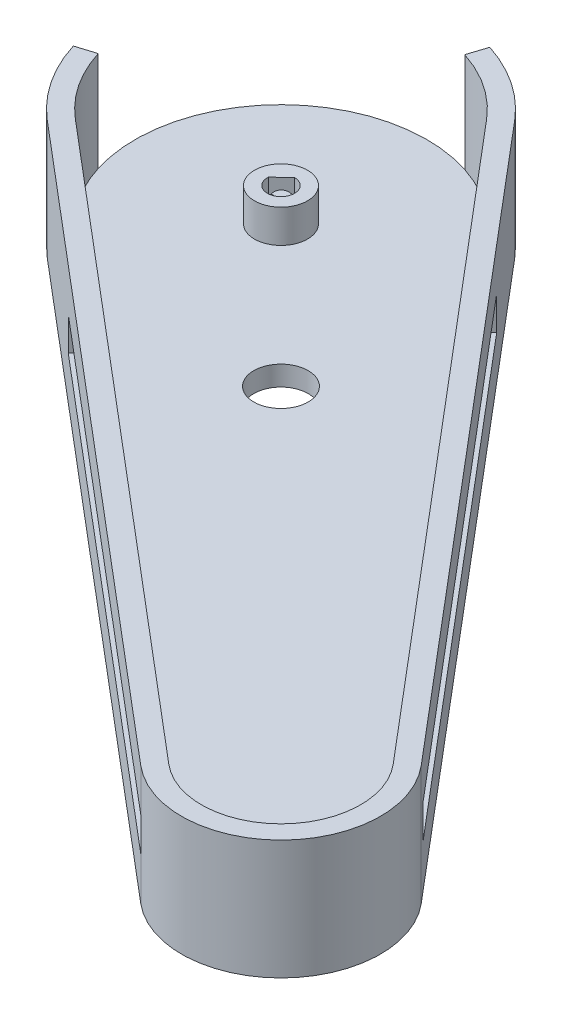
ISO-10303-21;
HEADER;
FILE_DESCRIPTION(('STEP AP214'),'2;1');
FILE_NAME('part.step','',(''),(''),'','','');
FILE_SCHEMA(('AUTOMOTIVE_DESIGN { 1 0 10303 214 1 1 1 1 }'));
ENDSEC;
DATA;
#1=APPLICATION_CONTEXT('core data for automotive mechanical design processes');
#2=APPLICATION_PROTOCOL_DEFINITION('international standard','automotive_design',2000,#1);
#3=PRODUCT_CONTEXT('',#1,'mechanical');
#4=PRODUCT('Part','Part','',(#3));
#5=PRODUCT_RELATED_PRODUCT_CATEGORY('part','',(#4));
#6=PRODUCT_DEFINITION_FORMATION('','',#4);
#7=PRODUCT_DEFINITION_CONTEXT('part definition',#1,'design');
#8=PRODUCT_DEFINITION('design','',#6,#7);
#9=PRODUCT_DEFINITION_SHAPE('','',#8);
#10=(LENGTH_UNIT() NAMED_UNIT(*) SI_UNIT(.MILLI.,.METRE.));
#11=(NAMED_UNIT(*) PLANE_ANGLE_UNIT() SI_UNIT($,.RADIAN.));
#12=(NAMED_UNIT(*) SI_UNIT($,.STERADIAN.) SOLID_ANGLE_UNIT());
#13=UNCERTAINTY_MEASURE_WITH_UNIT(LENGTH_MEASURE(1.E-05),#10,'distance_accuracy_value','');
#14=(GEOMETRIC_REPRESENTATION_CONTEXT(3) GLOBAL_UNCERTAINTY_ASSIGNED_CONTEXT((#13)) GLOBAL_UNIT_ASSIGNED_CONTEXT((#10,
#11,#12)) REPRESENTATION_CONTEXT('',''));
#15=CARTESIAN_POINT('',(0.,0.,0.));
#16=DIRECTION('',(0.,0.,1.));
#17=DIRECTION('',(1.,0.,0.));
#18=AXIS2_PLACEMENT_3D('',#15,#16,#17);
#19=CARTESIAN_POINT('',(-12.9144341357622,3.,15.2714567397174));
#20=DIRECTION('',(0.645721706788111,0.,-0.763572836985869));
#21=DIRECTION('',(-0.763572836985869,0.,-0.645721706788111));
#22=AXIS2_PLACEMENT_3D('',#19,#20,#21);
#23=PLANE('',#22);
#24=DIRECTION('',(-0.763572836985869,0.,-0.645721706788111));
#25=VECTOR('',#24,1.);
#26=CARTESIAN_POINT('',(-12.9144341357622,11.6,15.2714567397174));
#27=LINE('',#26,#25);
#28=CARTESIAN_POINT('',(32.7405812693717,11.6,53.8799994259803));
#29=VERTEX_POINT('',#28);
#30=CARTESIAN_POINT('',(-38.0703858584019,11.6,-6.00188261366093));
#31=VERTEX_POINT('',#30);
#32=EDGE_CURVE('E323',#29,#31,#27,.T.);
#33=ORIENTED_EDGE('',*,*,#32,.F.);
#34=DIRECTION('',(0.,-1.,0.));
#35=VECTOR('',#34,1.);
#36=CARTESIAN_POINT('',(32.7405812693714,3.,53.8799994259806));
#37=LINE('',#36,#35);
#38=CARTESIAN_POINT('',(32.7405812693718,18.,53.8799994259802));
#39=VERTEX_POINT('',#38);
#40=EDGE_CURVE('E407',#39,#29,#37,.T.);
#41=ORIENTED_EDGE('',*,*,#40,.F.);
#42=DIRECTION('',(0.763572836985869,0.,0.645721706788111));
#43=VECTOR('',#42,1.);
#44=CARTESIAN_POINT('',(-12.9144341357622,18.,15.2714567397174));
#45=LINE('',#44,#43);
#46=CARTESIAN_POINT('',(-58.5694495408956,18.,-23.3370859465461));
#47=VERTEX_POINT('',#46);
#48=EDGE_CURVE('E491',#47,#39,#45,.T.);
#49=ORIENTED_EDGE('',*,*,#48,.F.);
#50=DIRECTION('',(0.,-1.,0.));
#51=VECTOR('',#50,1.);
#52=CARTESIAN_POINT('',(-58.5694495408956,3.,-23.3370859465461));
#53=LINE('',#52,#51);
#54=CARTESIAN_POINT('',(-58.5694495408956,0.,-23.3370859465461));
#55=VERTEX_POINT('',#54);
#56=EDGE_CURVE('E599',#47,#55,#53,.T.);
#57=ORIENTED_EDGE('',*,*,#56,.T.);
#58=DIRECTION('',(0.763572836985869,0.,0.645721706788111));
#59=VECTOR('',#58,1.);
#60=CARTESIAN_POINT('',(-12.9144341357622,0.,15.2714567397174));
#61=LINE('',#60,#59);
#62=CARTESIAN_POINT('',(32.7405812693714,0.,53.8799994259806));
#63=VERTEX_POINT('',#62);
#64=EDGE_CURVE('E583',#55,#63,#61,.T.);
#65=ORIENTED_EDGE('',*,*,#64,.T.);
#66=CARTESIAN_POINT('',(32.7405812693714,6.5,53.8799994259806));
#67=VERTEX_POINT('',#66);
#68=EDGE_CURVE('E420',#67,#63,#37,.T.);
#69=ORIENTED_EDGE('',*,*,#68,.F.);
#70=DIRECTION('',(-0.763572836985869,0.,-0.645721706788111));
#71=VECTOR('',#70,1.);
#72=CARTESIAN_POINT('',(-12.9144341357622,6.5,15.2714567397174));
#73=LINE('',#72,#71);
#74=CARTESIAN_POINT('',(-38.0703858584019,6.5,-6.00188261366093));
#75=VERTEX_POINT('',#74);
#76=EDGE_CURVE('E304',#67,#75,#73,.T.);
#77=ORIENTED_EDGE('',*,*,#76,.T.);
#78=DIRECTION('',(0.,1.,0.));
#79=VECTOR('',#78,1.);
#80=CARTESIAN_POINT('',(-38.0703858584019,3.,-6.00188261366095));
#81=LINE('',#80,#79);
#82=EDGE_CURVE('E302',#75,#31,#81,.T.);
#83=ORIENTED_EDGE('',*,*,#82,.T.);
#84=EDGE_LOOP('',(#33,#41,#49,#57,#65,#69,#77,#83));
#85=FACE_BOUND('',#84,.T.);
#86=ADVANCED_FACE('F120',(#85),#23,.F.);
#87=CARTESIAN_POINT('',(15.2714567397174,3.,-12.9144341357622));
#88=DIRECTION('',(0.763572836985869,0.,-0.645721706788111));
#89=DIRECTION('',(-0.645721706788111,0.,-0.763572836985869));
#90=AXIS2_PLACEMENT_3D('',#87,#88,#89);
#91=PLANE('',#90);
#92=DIRECTION('',(0.645721706788111,0.,0.763572836985869));
#93=VECTOR('',#92,1.);
#94=CARTESIAN_POINT('',(15.2714567397174,0.,-12.9144341357622));
#95=LINE('',#94,#93);
#96=CARTESIAN_POINT('',(-23.3370859465461,0.,-58.5694495408956));
#97=VERTEX_POINT('',#96);
#98=CARTESIAN_POINT('',(53.8799994259812,0.,32.740581269371));
#99=VERTEX_POINT('',#98);
#100=EDGE_CURVE('E592',#97,#99,#95,.T.);
#101=ORIENTED_EDGE('',*,*,#100,.F.);
#102=DIRECTION('',(0.,-1.,0.));
#103=VECTOR('',#102,1.);
#104=CARTESIAN_POINT('',(-23.3370859465461,3.,-58.5694495408956));
#105=LINE('',#104,#103);
#106=CARTESIAN_POINT('',(-23.3370859465461,18.,-58.5694495408956));
#107=VERTEX_POINT('',#106);
#108=EDGE_CURVE('E601',#107,#97,#105,.T.);
#109=ORIENTED_EDGE('',*,*,#108,.F.);
#110=DIRECTION('',(-0.645721706788111,0.,-0.763572836985869));
#111=VECTOR('',#110,1.);
#112=CARTESIAN_POINT('',(15.2714567397174,18.,-12.9144341357622));
#113=LINE('',#112,#111);
#114=CARTESIAN_POINT('',(53.8799994259811,18.,32.7405812693711));
#115=VERTEX_POINT('',#114);
#116=EDGE_CURVE('E512',#115,#107,#113,.T.);
#117=ORIENTED_EDGE('',*,*,#116,.F.);
#118=DIRECTION('',(0.,-1.,0.));
#119=VECTOR('',#118,1.);
#120=CARTESIAN_POINT('',(53.8799994259812,3.,32.740581269371));
#121=LINE('',#120,#119);
#122=EDGE_CURVE('E425',#115,#99,#121,.T.);
#123=ORIENTED_EDGE('',*,*,#122,.T.);
#124=EDGE_LOOP('',(#101,#109,#117,#123));
#125=FACE_BOUND('',#124,.T.);
#126=DIRECTION('',(0.,-1.,0.));
#127=VECTOR('',#126,1.);
#128=CARTESIAN_POINT('',(52.2486525519134,3.,30.8114961114078));
#129=LINE('',#128,#127);
#130=CARTESIAN_POINT('',(52.2486525519134,11.6,30.8114961114078));
#131=VERTEX_POINT('',#130);
#132=CARTESIAN_POINT('',(52.2486525519135,6.5,30.8114961114078));
#133=VERTEX_POINT('',#132);
#134=EDGE_CURVE('E313',#131,#133,#129,.T.);
#135=ORIENTED_EDGE('',*,*,#134,.F.);
#136=DIRECTION('',(-0.645721706788111,0.,-0.763572836985869));
#137=VECTOR('',#136,1.);
#138=CARTESIAN_POINT('',(15.2714567397174,11.6,-12.9144341357622));
#139=LINE('',#138,#137);
#140=CARTESIAN_POINT('',(-8.47663627701917,11.6,-40.9968085815452));
#141=VERTEX_POINT('',#140);
#142=EDGE_CURVE('E320',#131,#141,#139,.T.);
#143=ORIENTED_EDGE('',*,*,#142,.T.);
#144=DIRECTION('',(0.,1.,0.));
#145=VECTOR('',#144,1.);
#146=CARTESIAN_POINT('',(-8.47663627701916,3.,-40.9968085815452));
#147=LINE('',#146,#145);
#148=CARTESIAN_POINT('',(-8.47663627701916,6.5,-40.9968085815452));
#149=VERTEX_POINT('',#148);
#150=EDGE_CURVE('E286',#149,#141,#147,.T.);
#151=ORIENTED_EDGE('',*,*,#150,.F.);
#152=DIRECTION('',(-0.645721706788111,0.,-0.763572836985869));
#153=VECTOR('',#152,1.);
#154=CARTESIAN_POINT('',(15.2714567397174,6.5,-12.9144341357622));
#155=LINE('',#154,#153);
#156=EDGE_CURVE('E295',#133,#149,#155,.T.);
#157=ORIENTED_EDGE('',*,*,#156,.F.);
#158=EDGE_LOOP('',(#135,#143,#151,#157));
#159=FACE_BOUND('',#158,.T.);
#160=ADVANCED_FACE('F396',(#125,#159),#91,.T.);
#161=CARTESIAN_POINT('',(12.9807382287599,18.,-10.977269015398));
#162=DIRECTION('',(0.763572836985867,0.,-0.645721706788114));
#163=DIRECTION('',(-0.645721706788114,0.,-0.763572836985867));
#164=AXIS2_PLACEMENT_3D('',#161,#162,#163);
#165=PLANE('',#164);
#166=DIRECTION('',(0.645721706788114,0.,0.763572836985867));
#167=VECTOR('',#166,1.);
#168=CARTESIAN_POINT('',(12.9807382287599,3.,-10.977269015398));
#169=LINE('',#168,#167);
#170=CARTESIAN_POINT('',(-25.6278044575038,3.,-56.6322844205313));
#171=VERTEX_POINT('',#170);
#172=CARTESIAN_POINT('',(51.5892809150236,3.,34.6777463897353));
#173=VERTEX_POINT('',#172);
#174=EDGE_CURVE('E494',#171,#173,#169,.T.);
#175=ORIENTED_EDGE('',*,*,#174,.T.);
#176=DIRECTION('',(0.,-1.,0.));
#177=VECTOR('',#176,1.);
#178=CARTESIAN_POINT('',(51.5892809150236,18.,34.6777463897353));
#179=LINE('',#178,#177);
#180=CARTESIAN_POINT('',(51.5892809150236,18.,34.6777463897353));
#181=VERTEX_POINT('',#180);
#182=EDGE_CURVE('E475',#181,#173,#179,.T.);
#183=ORIENTED_EDGE('',*,*,#182,.F.);
#184=DIRECTION('',(0.645721706788114,0.,0.763572836985867));
#185=VECTOR('',#184,1.);
#186=CARTESIAN_POINT('',(12.9807382287599,18.,-10.977269015398));
#187=LINE('',#186,#185);
#188=CARTESIAN_POINT('',(-25.6278044575038,18.,-56.6322844205313));
#189=VERTEX_POINT('',#188);
#190=EDGE_CURVE('E502',#189,#181,#187,.T.);
#191=ORIENTED_EDGE('',*,*,#190,.F.);
#192=DIRECTION('',(0.,-1.,0.));
#193=VECTOR('',#192,1.);
#194=CARTESIAN_POINT('',(-25.6278044575038,18.,-56.6322844205313));
#195=LINE('',#194,#193);
#196=EDGE_CURVE('E477',#189,#171,#195,.T.);
#197=ORIENTED_EDGE('',*,*,#196,.T.);
#198=EDGE_LOOP('',(#175,#183,#191,#197));
#199=FACE_BOUND('',#198,.T.);
#200=DIRECTION('',(-0.645721706788114,0.,-0.763572836985867));
#201=VECTOR('',#200,1.);
#202=CARTESIAN_POINT('',(12.9807382287599,11.6,-10.977269015398));
#203=LINE('',#202,#201);
#204=CARTESIAN_POINT('',(50.2842034157696,11.6,33.1344782633646));
#205=VERTEX_POINT('',#204);
#206=CARTESIAN_POINT('',(-10.4410854131632,11.6,-38.6738264295882));
#207=VERTEX_POINT('',#206);
#208=EDGE_CURVE('E318',#205,#207,#203,.T.);
#209=ORIENTED_EDGE('',*,*,#208,.F.);
#210=DIRECTION('',(0.,-1.,0.));
#211=VECTOR('',#210,1.);
#212=CARTESIAN_POINT('',(50.2842034157696,18.,33.1344782633646));
#213=LINE('',#212,#211);
#214=CARTESIAN_POINT('',(50.2842034157696,6.5,33.1344782633645));
#215=VERTEX_POINT('',#214);
#216=EDGE_CURVE('E301',#205,#215,#213,.T.);
#217=ORIENTED_EDGE('',*,*,#216,.T.);
#218=DIRECTION('',(-0.645721706788114,0.,-0.763572836985867));
#219=VECTOR('',#218,1.);
#220=CARTESIAN_POINT('',(12.9807382287599,6.5,-10.977269015398));
#221=LINE('',#220,#219);
#222=CARTESIAN_POINT('',(-10.4410854131632,6.5,-38.6738264295882));
#223=VERTEX_POINT('',#222);
#224=EDGE_CURVE('E292',#215,#223,#221,.T.);
#225=ORIENTED_EDGE('',*,*,#224,.T.);
#226=DIRECTION('',(0.,1.,0.));
#227=VECTOR('',#226,1.);
#228=CARTESIAN_POINT('',(-10.4410854131632,18.,-38.6738264295882));
#229=LINE('',#228,#227);
#230=EDGE_CURVE('E278',#223,#207,#229,.T.);
#231=ORIENTED_EDGE('',*,*,#230,.T.);
#232=EDGE_LOOP('',(#209,#217,#225,#231));
#233=FACE_BOUND('',#232,.T.);
#234=ADVANCED_FACE('F300',(#199,#233),#165,.F.);
#235=CARTESIAN_POINT('',(-10.9772690153977,18.,12.9807382287597));
#236=DIRECTION('',(0.645721706788109,0.,-0.763572836985871));
#237=DIRECTION('',(-0.763572836985871,0.,-0.645721706788109));
#238=AXIS2_PLACEMENT_3D('',#235,#236,#237);
#239=PLANE('',#238);
#240=DIRECTION('',(0.,-1.,0.));
#241=VECTOR('',#240,1.);
#242=CARTESIAN_POINT('',(34.6777463897358,18.,51.589280915023));
#243=LINE('',#242,#241);
#244=CARTESIAN_POINT('',(34.6777463897358,18.,51.589280915023));
#245=VERTEX_POINT('',#244);
#246=CARTESIAN_POINT('',(34.6777463897358,11.6,51.589280915023));
#247=VERTEX_POINT('',#246);
#248=EDGE_CURVE('E467',#245,#247,#243,.T.);
#249=ORIENTED_EDGE('',*,*,#248,.T.);
#250=DIRECTION('',(-0.763572836985871,0.,-0.645721706788109));
#251=VECTOR('',#250,1.);
#252=CARTESIAN_POINT('',(-10.9772690153977,11.6,12.9807382287597));
#253=LINE('',#252,#251);
#254=CARTESIAN_POINT('',(-36.1332207380376,11.6,-8.2926011246186));
#255=VERTEX_POINT('',#254);
#256=EDGE_CURVE('E12',#247,#255,#253,.T.);
#257=ORIENTED_EDGE('',*,*,#256,.T.);
#258=DIRECTION('',(0.,1.,0.));
#259=VECTOR('',#258,1.);
#260=CARTESIAN_POINT('',(-36.1332207380376,18.,-8.29260112461862));
#261=LINE('',#260,#259);
#262=CARTESIAN_POINT('',(-36.1332207380376,6.5,-8.29260112461862));
#263=VERTEX_POINT('',#262);
#264=EDGE_CURVE('E431',#263,#255,#261,.T.);
#265=ORIENTED_EDGE('',*,*,#264,.F.);
#266=DIRECTION('',(-0.763572836985871,0.,-0.645721706788109));
#267=VECTOR('',#266,1.);
#268=CARTESIAN_POINT('',(-10.9772690153977,6.5,12.9807382287597));
#269=LINE('',#268,#267);
#270=CARTESIAN_POINT('',(34.6777463897358,6.5,51.589280915023));
#271=VERTEX_POINT('',#270);
#272=EDGE_CURVE('E127',#271,#263,#269,.T.);
#273=ORIENTED_EDGE('',*,*,#272,.F.);
#274=CARTESIAN_POINT('',(34.6777463897358,3.,51.589280915023));
#275=VERTEX_POINT('',#274);
#276=EDGE_CURVE('E469',#271,#275,#243,.T.);
#277=ORIENTED_EDGE('',*,*,#276,.T.);
#278=DIRECTION('',(0.763572836985871,0.,0.645721706788109));
#279=VECTOR('',#278,1.);
#280=CARTESIAN_POINT('',(-10.9772690153977,3.,12.9807382287597));
#281=LINE('',#280,#279);
#282=CARTESIAN_POINT('',(-56.6322844205313,3.,-25.6278044575037));
#283=VERTEX_POINT('',#282);
#284=EDGE_CURVE('E489',#283,#275,#281,.T.);
#285=ORIENTED_EDGE('',*,*,#284,.F.);
#286=DIRECTION('',(0.,-1.,0.));
#287=VECTOR('',#286,1.);
#288=CARTESIAN_POINT('',(-56.6322844205313,18.,-25.6278044575037));
#289=LINE('',#288,#287);
#290=CARTESIAN_POINT('',(-56.6322844205313,18.,-25.6278044575037));
#291=VERTEX_POINT('',#290);
#292=EDGE_CURVE('E480',#291,#283,#289,.T.);
#293=ORIENTED_EDGE('',*,*,#292,.F.);
#294=DIRECTION('',(0.763572836985871,0.,0.645721706788109));
#295=VECTOR('',#294,1.);
#296=CARTESIAN_POINT('',(-10.9772690153977,18.,12.9807382287597));
#297=LINE('',#296,#295);
#298=EDGE_CURVE('E474',#291,#245,#297,.T.);
#299=ORIENTED_EDGE('',*,*,#298,.T.);
#300=EDGE_LOOP('',(#249,#257,#265,#273,#277,#285,#293,#299));
#301=FACE_BOUND('',#300,.T.);
#302=ADVANCED_FACE('F441',(#301),#239,.T.);
#303=CARTESIAN_POINT('',(-42.4264068711929,3.,-42.4264068711928));
#304=DIRECTION('',(0.,-1.,0.));
#305=DIRECTION('',(0.,0.,-1.));
#306=AXIS2_PLACEMENT_3D('',#303,#304,#305);
#307=CYLINDRICAL_SURFACE('',#306,25.);
#308=DIRECTION('',(0.,1.,0.));
#309=VECTOR('',#308,1.);
#310=CARTESIAN_POINT('',(-34.7351023926479,0.,-66.2138791080303));
#311=LINE('',#310,#309);
#312=CARTESIAN_POINT('',(-34.7351023926479,0.,-66.2138791080303));
#313=VERTEX_POINT('',#312);
#314=CARTESIAN_POINT('',(-34.7351023926479,18.,-66.2138791080303));
#315=VERTEX_POINT('',#314);
#316=EDGE_CURVE('E345',#313,#315,#311,.T.);
#317=ORIENTED_EDGE('',*,*,#316,.T.);
#318=CARTESIAN_POINT('',(-42.4264068711929,18.,-42.4264068711928));
#319=DIRECTION('',(0.,1.,0.));
#320=DIRECTION('',(0.,0.,1.));
#321=AXIS2_PLACEMENT_3D('',#318,#319,#320);
#322=CIRCLE('',#321,25.);
#323=EDGE_CURVE('E508',#107,#315,#322,.T.);
#324=ORIENTED_EDGE('',*,*,#323,.F.);
#325=ORIENTED_EDGE('',*,*,#108,.T.);
#326=CARTESIAN_POINT('',(-42.4264068711929,0.,-42.4264068711928));
#327=DIRECTION('',(0.,1.,0.));
#328=DIRECTION('',(0.,0.,1.));
#329=AXIS2_PLACEMENT_3D('',#326,#327,#328);
#330=CIRCLE('',#329,25.);
#331=EDGE_CURVE('E596',#97,#313,#330,.T.);
#332=ORIENTED_EDGE('',*,*,#331,.T.);
#333=EDGE_LOOP('',(#317,#324,#325,#332));
#334=FACE_BOUND('',#333,.T.);
#335=ADVANCED_FACE('F612',(#334),#307,.T.);
#336=DIRECTION('',(0.,1.,0.));
#337=VECTOR('',#336,1.);
#338=CARTESIAN_POINT('',(-66.293267990391,0.,-34.9851072322245));
#339=LINE('',#338,#337);
#340=CARTESIAN_POINT('',(-66.293267990391,0.,-34.9851072322245));
#341=VERTEX_POINT('',#340);
#342=CARTESIAN_POINT('',(-66.293267990391,18.,-34.9851072322245));
#343=VERTEX_POINT('',#342);
#344=EDGE_CURVE('E348',#341,#343,#339,.T.);
#345=ORIENTED_EDGE('',*,*,#344,.F.);
#346=EDGE_CURVE('E595',#341,#55,#330,.T.);
#347=ORIENTED_EDGE('',*,*,#346,.T.);
#348=ORIENTED_EDGE('',*,*,#56,.F.);
#349=EDGE_CURVE('E511',#343,#47,#322,.T.);
#350=ORIENTED_EDGE('',*,*,#349,.F.);
#351=EDGE_LOOP('',(#345,#347,#348,#350));
#352=FACE_BOUND('',#351,.T.);
#353=ADVANCED_FACE('F623',(#352),#307,.T.);
#354=CARTESIAN_POINT('',(0.,0.,0.));
#355=DIRECTION('',(0.,1.,0.));
#356=DIRECTION('',(0.,0.,1.));
#357=AXIS2_PLACEMENT_3D('',#354,#355,#356);
#358=PLANE('',#357);
#359=CARTESIAN_POINT('',(42.4264068711934,0.,42.4264068711923));
#360=DIRECTION('',(0.,1.,0.));
#361=DIRECTION('',(0.,0.,1.));
#362=AXIS2_PLACEMENT_3D('',#359,#360,#361);
#363=CIRCLE('',#362,3.5);
#364=CARTESIAN_POINT('',(42.4264068711934,0.,45.9264068711923));
#365=VERTEX_POINT('',#364);
#366=EDGE_CURVE('E580',#365,#365,#363,.T.);
#367=ORIENTED_EDGE('',*,*,#366,.T.);
#368=EDGE_LOOP('',(#367));
#369=FACE_BOUND('',#368,.T.);
#370=CARTESIAN_POINT('',(-21.2132034355963,0.,-21.2132034355965));
#371=DIRECTION('',(0.,1.,0.));
#372=DIRECTION('',(0.,0.,1.));
#373=AXIS2_PLACEMENT_3D('',#370,#371,#372);
#374=CIRCLE('',#373,4.1);
#375=CARTESIAN_POINT('',(-21.2132034355963,0.,-17.1132034355965));
#376=VERTEX_POINT('',#375);
#377=EDGE_CURVE('E520',#376,#376,#374,.T.);
#378=ORIENTED_EDGE('',*,*,#377,.T.);
#379=EDGE_LOOP('',(#378));
#380=FACE_BOUND('',#379,.T.);
#381=DIRECTION('',(-0.737397720021552,0.,0.67545880888994));
#382=VECTOR('',#381,1.);
#383=CARTESIAN_POINT('',(-41.5018278449423,0.,-45.3075048053358));
#384=LINE('',#383,#382);
#385=CARTESIAN_POINT('',(-42.4092153421002,0.,-44.4763347848833));
#386=VERTEX_POINT('',#385);
#387=CARTESIAN_POINT('',(-44.4699748269553,0.,-42.588672117567));
#388=VERTEX_POINT('',#387);
#389=EDGE_CURVE('E537',#386,#388,#384,.T.);
#390=ORIENTED_EDGE('',*,*,#389,.T.);
#391=CARTESIAN_POINT('',(-42.4264068711929,0.,-42.4264068711928));
#392=DIRECTION('',(0.,1.,0.));
#393=DIRECTION('',(0.,0.,1.));
#394=AXIS2_PLACEMENT_3D('',#391,#392,#393);
#395=CIRCLE('',#394,2.04999999999999);
#396=EDGE_CURVE('E366',#388,#386,#395,.T.);
#397=ORIENTED_EDGE('',*,*,#396,.T.);
#398=EDGE_LOOP('',(#390,#397));
#399=FACE_BOUND('',#398,.T.);
#400=DIRECTION('',(-0.307652179141798,0.,0.9514988894735));
#401=VECTOR('',#400,1.);
#402=CARTESIAN_POINT('',(-50.8302653295055,0.,-16.4351656822545));
#403=LINE('',#402,#401);
#404=CARTESIAN_POINT('',(-35.6580589300733,0.,-63.3593824396098));
#405=VERTEX_POINT('',#404);
#406=EDGE_CURVE('E336',#313,#405,#403,.T.);
#407=ORIENTED_EDGE('',*,*,#406,.F.);
#408=ORIENTED_EDGE('',*,*,#331,.F.);
#409=ORIENTED_EDGE('',*,*,#100,.T.);
#410=CARTESIAN_POINT('',(42.4264068711934,0.,42.4264068711923));
#411=DIRECTION('',(0.,1.,0.));
#412=DIRECTION('',(0.,0.,1.));
#413=AXIS2_PLACEMENT_3D('',#410,#411,#412);
#414=CIRCLE('',#413,15.);
#415=EDGE_CURVE('E590',#63,#99,#414,.T.);
#416=ORIENTED_EDGE('',*,*,#415,.F.);
#417=ORIENTED_EDGE('',*,*,#64,.F.);
#418=ORIENTED_EDGE('',*,*,#346,.F.);
#419=DIRECTION('',(-0.954674444767924,0.,0.297651985558732));
#420=VECTOR('',#419,1.);
#421=CARTESIAN_POINT('',(-15.814759176637,0.,-50.7234863821035));
#422=LINE('',#421,#420);
#423=CARTESIAN_POINT('',(-63.4292446560872,0.,-35.8780631889007));
#424=VERTEX_POINT('',#423);
#425=EDGE_CURVE('E334',#424,#341,#422,.T.);
#426=ORIENTED_EDGE('',*,*,#425,.F.);
#427=CARTESIAN_POINT('',(-42.4264068711929,0.,-42.4264068711928));
#428=DIRECTION('',(0.,1.,0.));
#429=DIRECTION('',(0.,0.,1.));
#430=AXIS2_PLACEMENT_3D('',#427,#428,#429);
#431=CIRCLE('',#430,22.);
#432=EDGE_CURVE('E331',#405,#424,#431,.T.);
#433=ORIENTED_EDGE('',*,*,#432,.F.);
#434=EDGE_LOOP('',(#407,#408,#409,#416,#417,#418,#426,#433));
#435=FACE_BOUND('',#434,.T.);
#436=ADVANCED_FACE('F542',(#369,#380,#399,#435),#358,.F.);
#437=CARTESIAN_POINT('',(-42.4264068711929,18.,-42.4264068711928));
#438=DIRECTION('',(0.,-1.,0.));
#439=DIRECTION('',(0.,0.,-1.));
#440=AXIS2_PLACEMENT_3D('',#437,#438,#439);
#441=CYLINDRICAL_SURFACE('',#440,22.);
#442=CARTESIAN_POINT('',(-42.4264068711929,18.,-42.4264068711928));
#443=DIRECTION('',(0.,1.,0.));
#444=DIRECTION('',(0.,0.,1.));
#445=AXIS2_PLACEMENT_3D('',#442,#443,#444);
#446=CIRCLE('',#445,22.);
#447=CARTESIAN_POINT('',(-35.6580589300733,18.,-63.3593824396098));
#448=VERTEX_POINT('',#447);
#449=EDGE_CURVE('E504',#189,#448,#446,.T.);
#450=ORIENTED_EDGE('',*,*,#449,.T.);
#451=DIRECTION('',(0.,1.,0.));
#452=VECTOR('',#451,1.);
#453=CARTESIAN_POINT('',(-35.6580589300733,0.,-63.3593824396098));
#454=LINE('',#453,#452);
#455=CARTESIAN_POINT('',(-35.6580589300733,3.,-63.3593824396098));
#456=VERTEX_POINT('',#455);
#457=EDGE_CURVE('E344',#456,#448,#454,.T.);
#458=ORIENTED_EDGE('',*,*,#457,.F.);
#459=CARTESIAN_POINT('',(-42.4264068711929,3.,-42.4264068711928));
#460=DIRECTION('',(0.,1.,0.));
#461=DIRECTION('',(0.,0.,1.));
#462=AXIS2_PLACEMENT_3D('',#459,#460,#461);
#463=CIRCLE('',#462,22.);
#464=EDGE_CURVE('E497',#171,#456,#463,.T.);
#465=ORIENTED_EDGE('',*,*,#464,.F.);
#466=ORIENTED_EDGE('',*,*,#196,.F.);
#467=EDGE_LOOP('',(#450,#458,#465,#466));
#468=FACE_BOUND('',#467,.T.);
#469=ADVANCED_FACE('F633',(#468),#441,.F.);
#470=CARTESIAN_POINT('',(-63.4292446560872,3.,-35.8780631889007));
#471=VERTEX_POINT('',#470);
#472=EDGE_CURVE('E499',#471,#283,#463,.T.);
#473=ORIENTED_EDGE('',*,*,#472,.F.);
#474=DIRECTION('',(0.,1.,0.));
#475=VECTOR('',#474,1.);
#476=CARTESIAN_POINT('',(-63.4292446560872,0.,-35.8780631889007));
#477=LINE('',#476,#475);
#478=CARTESIAN_POINT('',(-63.4292446560872,18.,-35.8780631889007));
#479=VERTEX_POINT('',#478);
#480=EDGE_CURVE('E339',#471,#479,#477,.T.);
#481=ORIENTED_EDGE('',*,*,#480,.T.);
#482=EDGE_CURVE('E507',#479,#291,#446,.T.);
#483=ORIENTED_EDGE('',*,*,#482,.T.);
#484=ORIENTED_EDGE('',*,*,#292,.T.);
#485=EDGE_LOOP('',(#473,#481,#483,#484));
#486=FACE_BOUND('',#485,.T.);
#487=ADVANCED_FACE('F627',(#486),#441,.F.);
#488=CARTESIAN_POINT('',(0.,18.,0.));
#489=DIRECTION('',(0.,1.,0.));
#490=DIRECTION('',(0.,0.,1.));
#491=AXIS2_PLACEMENT_3D('',#488,#489,#490);
#492=PLANE('',#491);
#493=ORIENTED_EDGE('',*,*,#323,.T.);
#494=DIRECTION('',(-0.307652179141798,0.,0.9514988894735));
#495=VECTOR('',#494,1.);
#496=CARTESIAN_POINT('',(-50.8302653295055,18.,-16.4351656822545));
#497=LINE('',#496,#495);
#498=EDGE_CURVE('E328',#315,#448,#497,.T.);
#499=ORIENTED_EDGE('',*,*,#498,.T.);
#500=ORIENTED_EDGE('',*,*,#449,.F.);
#501=ORIENTED_EDGE('',*,*,#190,.T.);
#502=CARTESIAN_POINT('',(42.4264068711934,18.,42.4264068711923));
#503=DIRECTION('',(0.,1.,0.));
#504=DIRECTION('',(0.,0.,1.));
#505=AXIS2_PLACEMENT_3D('',#502,#503,#504);
#506=CIRCLE('',#505,11.9999999999996);
#507=EDGE_CURVE('E486',#245,#181,#506,.T.);
#508=ORIENTED_EDGE('',*,*,#507,.F.);
#509=ORIENTED_EDGE('',*,*,#298,.F.);
#510=ORIENTED_EDGE('',*,*,#482,.F.);
#511=DIRECTION('',(-0.954674444767924,0.,0.297651985558732));
#512=VECTOR('',#511,1.);
#513=CARTESIAN_POINT('',(-15.814759176637,18.,-50.7234863821035));
#514=LINE('',#513,#512);
#515=EDGE_CURVE('E325',#479,#343,#514,.T.);
#516=ORIENTED_EDGE('',*,*,#515,.T.);
#517=ORIENTED_EDGE('',*,*,#349,.T.);
#518=ORIENTED_EDGE('',*,*,#48,.T.);
#519=CARTESIAN_POINT('',(42.4264068711934,18.,42.4264068711923));
#520=DIRECTION('',(0.,1.,0.));
#521=DIRECTION('',(0.,0.,1.));
#522=AXIS2_PLACEMENT_3D('',#519,#520,#521);
#523=CIRCLE('',#522,14.9999999999996);
#524=EDGE_CURVE('E417',#39,#115,#523,.T.);
#525=ORIENTED_EDGE('',*,*,#524,.T.);
#526=ORIENTED_EDGE('',*,*,#116,.T.);
#527=EDGE_LOOP('',(#493,#499,#500,#501,#508,#509,#510,#516,#517,#518,#525,#526));
#528=FACE_BOUND('',#527,.T.);
#529=ADVANCED_FACE('F615',(#528),#492,.T.);
#530=CARTESIAN_POINT('',(-41.5018278449423,0.,-45.3075048053358));
#531=DIRECTION('',(-0.67545880888994,0.,-0.737397720021552));
#532=DIRECTION('',(-0.737397720021552,0.,0.67545880888994));
#533=AXIS2_PLACEMENT_3D('',#530,#531,#532);
#534=PLANE('',#533);
#535=DIRECTION('',(0.,1.,0.));
#536=VECTOR('',#535,1.);
#537=CARTESIAN_POINT('',(-44.4699748269553,0.,-42.588672117567));
#538=LINE('',#537,#536);
#539=CARTESIAN_POINT('',(-44.4699748269553,4.95320864448199,-42.588672117567));
#540=VERTEX_POINT('',#539);
#541=CARTESIAN_POINT('',(-44.4699748269553,8.,-42.588672117567));
#542=VERTEX_POINT('',#541);
#543=EDGE_CURVE('E530',#540,#542,#538,.T.);
#544=ORIENTED_EDGE('',*,*,#543,.F.);
#545=CARTESIAN_POINT('',(-43.4395950845278,4.95320864448199,-43.5325034512252));
#546=DIRECTION('',(0.675458808889941,0.,0.737397720021552));
#547=DIRECTION('',(0.737397720021552,0.,-0.675458808889941));
#548=AXIS2_PLACEMENT_3D('',#545,#546,#547);
#549=CIRCLE('',#548,1.3973188612482);
#550=CARTESIAN_POINT('',(-42.4092153421002,4.95320864448199,-44.4763347848833));
#551=VERTEX_POINT('',#550);
#552=EDGE_CURVE('E355',#551,#540,#549,.T.);
#553=ORIENTED_EDGE('',*,*,#552,.F.);
#554=DIRECTION('',(0.,1.,0.));
#555=VECTOR('',#554,1.);
#556=CARTESIAN_POINT('',(-42.4092153421002,0.,-44.4763347848833));
#557=LINE('',#556,#555);
#558=CARTESIAN_POINT('',(-42.4092153421002,8.,-44.4763347848833));
#559=VERTEX_POINT('',#558);
#560=EDGE_CURVE('E531',#551,#559,#557,.T.);
#561=ORIENTED_EDGE('',*,*,#560,.T.);
#562=DIRECTION('',(-0.737397720021552,0.,0.67545880888994));
#563=VECTOR('',#562,1.);
#564=CARTESIAN_POINT('',(-41.5018278449423,8.,-45.3075048053358));
#565=LINE('',#564,#563);
#566=EDGE_CURVE('E534',#559,#542,#565,.T.);
#567=ORIENTED_EDGE('',*,*,#566,.T.);
#568=EDGE_LOOP('',(#544,#553,#561,#567));
#569=FACE_BOUND('',#568,.T.);
#570=ADVANCED_FACE('F385',(#569),#534,.F.);
#571=CARTESIAN_POINT('',(42.4264068711934,3.,42.4264068711923));
#572=DIRECTION('',(0.,-1.,0.));
#573=DIRECTION('',(0.,0.,-1.));
#574=AXIS2_PLACEMENT_3D('',#571,#572,#573);
#575=CYLINDRICAL_SURFACE('',#574,15.);
#576=ORIENTED_EDGE('',*,*,#415,.T.);
#577=ORIENTED_EDGE('',*,*,#122,.F.);
#578=ORIENTED_EDGE('',*,*,#524,.F.);
#579=ORIENTED_EDGE('',*,*,#40,.T.);
#580=DIRECTION('',(0.,-1.,0.));
#581=VECTOR('',#580,1.);
#582=CARTESIAN_POINT('',(32.7405812693717,3.,53.8799994259803));
#583=LINE('',#582,#581);
#584=EDGE_CURVE('E315',#29,#67,#583,.T.);
#585=ORIENTED_EDGE('',*,*,#584,.T.);
#586=ORIENTED_EDGE('',*,*,#68,.T.);
#587=EDGE_LOOP('',(#576,#577,#578,#579,#585,#586));
#588=FACE_BOUND('',#587,.T.);
#589=ADVANCED_FACE('F415',(#588),#575,.T.);
#590=CARTESIAN_POINT('',(0.,3.,0.));
#591=DIRECTION('',(0.,1.,0.));
#592=DIRECTION('',(0.,0.,1.));
#593=AXIS2_PLACEMENT_3D('',#590,#591,#592);
#594=PLANE('',#593);
#595=CARTESIAN_POINT('',(-42.4264068711929,3.,-42.4264068711928));
#596=DIRECTION('',(0.,1.,0.));
#597=DIRECTION('',(0.,0.,1.));
#598=AXIS2_PLACEMENT_3D('',#595,#596,#597);
#599=CIRCLE('',#598,4.00000000000001);
#600=CARTESIAN_POINT('',(-42.4264068711929,3.,-38.4264068711928));
#601=VERTEX_POINT('',#600);
#602=EDGE_CURVE('E419',#601,#601,#599,.T.);
#603=ORIENTED_EDGE('',*,*,#602,.F.);
#604=EDGE_LOOP('',(#603));
#605=FACE_BOUND('',#604,.T.);
#606=CARTESIAN_POINT('',(-21.2132034355963,3.,-21.2132034355965));
#607=DIRECTION('',(0.,1.,0.));
#608=DIRECTION('',(0.,0.,1.));
#609=AXIS2_PLACEMENT_3D('',#606,#607,#608);
#610=CIRCLE('',#609,4.1);
#611=CARTESIAN_POINT('',(-21.2132034355963,3.,-17.1132034355965));
#612=VERTEX_POINT('',#611);
#613=EDGE_CURVE('E517',#612,#612,#610,.T.);
#614=ORIENTED_EDGE('',*,*,#613,.F.);
#615=EDGE_LOOP('',(#614));
#616=FACE_BOUND('',#615,.T.);
#617=ORIENTED_EDGE('',*,*,#464,.T.);
#618=CARTESIAN_POINT('',(-42.4264068711929,3.,-42.4264068711928));
#619=DIRECTION('',(0.,1.,0.));
#620=DIRECTION('',(0.,0.,1.));
#621=AXIS2_PLACEMENT_3D('',#618,#619,#620);
#622=CIRCLE('',#621,22.);
#623=EDGE_CURVE('E343',#456,#471,#622,.T.);
#624=ORIENTED_EDGE('',*,*,#623,.T.);
#625=ORIENTED_EDGE('',*,*,#472,.T.);
#626=ORIENTED_EDGE('',*,*,#284,.T.);
#627=CARTESIAN_POINT('',(42.4264068711934,3.,42.4264068711923));
#628=DIRECTION('',(0.,1.,0.));
#629=DIRECTION('',(0.,0.,1.));
#630=AXIS2_PLACEMENT_3D('',#627,#628,#629);
#631=CIRCLE('',#630,11.9999999999996);
#632=EDGE_CURVE('E492',#275,#173,#631,.T.);
#633=ORIENTED_EDGE('',*,*,#632,.T.);
#634=ORIENTED_EDGE('',*,*,#174,.F.);
#635=EDGE_LOOP('',(#617,#624,#625,#626,#633,#634));
#636=FACE_BOUND('',#635,.T.);
#637=CARTESIAN_POINT('',(42.4264068711934,3.,42.4264068711923));
#638=DIRECTION('',(0.,1.,0.));
#639=DIRECTION('',(0.,0.,1.));
#640=AXIS2_PLACEMENT_3D('',#637,#638,#639);
#641=CIRCLE('',#640,3.5);
#642=CARTESIAN_POINT('',(42.4264068711934,3.,45.9264068711923));
#643=VERTEX_POINT('',#642);
#644=EDGE_CURVE('E578',#643,#643,#641,.T.);
#645=ORIENTED_EDGE('',*,*,#644,.F.);
#646=EDGE_LOOP('',(#645));
#647=FACE_BOUND('',#646,.T.);
#648=ADVANCED_FACE('F567',(#605,#616,#636,#647),#594,.T.);
#649=CARTESIAN_POINT('',(42.4264068711934,0.,42.4264068711923));
#650=DIRECTION('',(0.,1.,0.));
#651=DIRECTION('',(0.,0.,1.));
#652=AXIS2_PLACEMENT_3D('',#649,#650,#651);
#653=CYLINDRICAL_SURFACE('',#652,3.5);
#654=ORIENTED_EDGE('',*,*,#366,.F.);
#655=EDGE_LOOP('',(#654));
#656=FACE_BOUND('',#655,.T.);
#657=ORIENTED_EDGE('',*,*,#644,.T.);
#658=EDGE_LOOP('',(#657));
#659=FACE_BOUND('',#658,.T.);
#660=ADVANCED_FACE('F570',(#656,#659),#653,.F.);
#661=CARTESIAN_POINT('',(42.4264068711934,18.,42.4264068711923));
#662=DIRECTION('',(0.,-1.,0.));
#663=DIRECTION('',(0.,0.,-1.));
#664=AXIS2_PLACEMENT_3D('',#661,#662,#663);
#665=CYLINDRICAL_SURFACE('',#664,11.9999999999996);
#666=ORIENTED_EDGE('',*,*,#632,.F.);
#667=ORIENTED_EDGE('',*,*,#276,.F.);
#668=EDGE_CURVE('E462',#247,#271,#243,.T.);
#669=ORIENTED_EDGE('',*,*,#668,.F.);
#670=ORIENTED_EDGE('',*,*,#248,.F.);
#671=ORIENTED_EDGE('',*,*,#507,.T.);
#672=ORIENTED_EDGE('',*,*,#182,.T.);
#673=EDGE_LOOP('',(#666,#667,#669,#670,#671,#672));
#674=FACE_BOUND('',#673,.T.);
#675=ADVANCED_FACE('F465',(#674),#665,.F.);
#676=CARTESIAN_POINT('',(-21.2132034355963,0.,-21.2132034355965));
#677=DIRECTION('',(0.,1.,0.));
#678=DIRECTION('',(0.,0.,1.));
#679=AXIS2_PLACEMENT_3D('',#676,#677,#678);
#680=CYLINDRICAL_SURFACE('',#679,4.1);
#681=ORIENTED_EDGE('',*,*,#377,.F.);
#682=EDGE_LOOP('',(#681));
#683=FACE_BOUND('',#682,.T.);
#684=ORIENTED_EDGE('',*,*,#613,.T.);
#685=EDGE_LOOP('',(#684));
#686=FACE_BOUND('',#685,.T.);
#687=ADVANCED_FACE('F555',(#683,#686),#680,.F.);
#688=CARTESIAN_POINT('',(-42.4264068711929,3.,-42.4264068711928));
#689=DIRECTION('',(0.,1.,0.));
#690=DIRECTION('',(0.,0.,1.));
#691=AXIS2_PLACEMENT_3D('',#688,#689,#690);
#692=CYLINDRICAL_SURFACE('',#691,4.00000000000001);
#693=CARTESIAN_POINT('',(-43.9276463840479,4.95320864448199,-46.1340044660031));
#694=CARTESIAN_POINT('',(-43.9276448381017,4.87733784771125,-46.134004529163));
#695=CARTESIAN_POINT('',(-43.9337914563156,4.80147528919776,-46.1315338429591));
#696=CARTESIAN_POINT('',(-43.9579806741196,4.65201263484662,-46.1215996165163));
#697=CARTESIAN_POINT('',(-43.9760243002885,4.57841273482477,-46.114135645412));
#698=CARTESIAN_POINT('',(-44.0228929844835,4.43566801973753,-46.0940864834317));
#699=CARTESIAN_POINT('',(-44.0516952047226,4.36651412882146,-46.081512135657));
#700=CARTESIAN_POINT('',(-44.1186143957809,4.23415152522354,-46.0510145976612));
#701=CARTESIAN_POINT('',(-44.1567337224641,4.17094432179001,-46.0330900543699));
#702=CARTESIAN_POINT('',(-44.2422666203821,4.04954993089183,-45.9908159010798));
#703=CARTESIAN_POINT('',(-44.2899852230131,3.99165550582564,-45.966242550861));
#704=CARTESIAN_POINT('',(-44.391734970511,3.88517079734099,-45.9107775799398));
#705=CARTESIAN_POINT('',(-44.4457672425157,3.83658217932532,-45.8798848303355));
#706=CARTESIAN_POINT('',(-44.5597547324929,3.74872991809658,-45.8106929868691));
#707=CARTESIAN_POINT('',(-44.6198362096399,3.70977727882403,-45.7722052208693));
#708=CARTESIAN_POINT('',(-44.7422197389248,3.64436899980147,-45.688689539006));
#709=CARTESIAN_POINT('',(-44.8045211237219,3.61790963789041,-45.6436635763216));
#710=CARTESIAN_POINT('',(-44.9266080359223,3.57924431047146,-45.5496586336835));
#711=CARTESIAN_POINT('',(-44.986399378856,3.56653589737694,-45.5008942994198));
#712=CARTESIAN_POINT('',(-45.10377270404,3.55413104573047,-45.3992393135198));
#713=CARTESIAN_POINT('',(-45.1613553059534,3.55443093057379,-45.3463498320145));
#714=CARTESIAN_POINT('',(-45.2701205036933,3.56772511144486,-45.240445076684));
#715=CARTESIAN_POINT('',(-45.3214718610134,3.58017271665565,-45.1875331062649));
#716=CARTESIAN_POINT('',(-45.4193188761471,3.61649918789651,-45.0811579343975));
#717=CARTESIAN_POINT('',(-45.4658141974326,3.64037884553922,-45.0276946950273));
#718=CARTESIAN_POINT('',(-45.5537702569443,3.69918584468339,-44.9212881968308));
#719=CARTESIAN_POINT('',(-45.5951529478335,3.73426062860178,-44.8683622054981));
#720=CARTESIAN_POINT('',(-45.6717314665789,3.81433767860731,-44.7656331291609));
#721=CARTESIAN_POINT('',(-45.7069254557572,3.85934288612225,-44.7158309750734));
#722=CARTESIAN_POINT('',(-45.7726541974567,3.9607142928893,-44.6187215441381));
#723=CARTESIAN_POINT('',(-45.8028566264503,4.01754542931988,-44.5716739483322));
#724=CARTESIAN_POINT('',(-45.8563512579973,4.1395748314007,-44.4850663853991));
#725=CARTESIAN_POINT('',(-45.8796421666119,4.20477466052513,-44.4455078208307));
#726=CARTESIAN_POINT('',(-45.9197812134304,4.34314258198496,-44.3752544128793));
#727=CARTESIAN_POINT('',(-45.9365130424007,4.41642733263544,-44.3447217572377));
#728=CARTESIAN_POINT('',(-45.9630743912344,4.56799955471252,-44.2953047544717));
#729=CARTESIAN_POINT('',(-45.9729071489249,4.64628466055858,-44.2764149437101));
#730=CARTESIAN_POINT('',(-45.9854362554697,4.80152966426041,-44.2521910347603));
#731=CARTESIAN_POINT('',(-45.9884585020757,4.87836671753589,-44.2462383982829));
#732=CARTESIAN_POINT('',(-45.988351873151,5.0320109945403,-44.2464478658668));
#733=CARTESIAN_POINT('',(-45.985224260611,5.10881822115464,-44.2526074824461));
#734=CARTESIAN_POINT('',(-45.9730460031074,5.25709215166381,-44.2761399469941));
#735=CARTESIAN_POINT('',(-45.9642312016183,5.32865030284419,-44.2930659430875));
#736=CARTESIAN_POINT('',(-45.9408554576563,5.46772127416344,-44.3367104296157));
#737=CARTESIAN_POINT('',(-45.9262934352324,5.53523333125923,-44.3634307604212));
#738=CARTESIAN_POINT('',(-45.8907373860472,5.66684262231012,-44.4263464803868));
#739=CARTESIAN_POINT('',(-45.8695415101671,5.73074571618242,-44.4628331253268));
#740=CARTESIAN_POINT('',(-45.8207872513306,5.85112307224902,-44.54309852548));
#741=CARTESIAN_POINT('',(-45.7932268180944,5.9075949313214,-44.586879629263));
#742=CARTESIAN_POINT('',(-45.7300050848628,6.01464348614198,-44.6824406359651));
#743=CARTESIAN_POINT('',(-45.6939884251762,6.06474118548234,-44.7345237070945));
#744=CARTESIAN_POINT('',(-45.6148790023723,6.15390614561179,-44.8426281703997));
#745=CARTESIAN_POINT('',(-45.5717864077341,6.19297366897111,-44.8986494687873));
#746=CARTESIAN_POINT('',(-45.4792121734065,6.25863927903421,-45.0120793529315));
#747=CARTESIAN_POINT('',(-45.4297684170435,6.28530728701524,-45.0694781916711));
#748=CARTESIAN_POINT('',(-45.3252305818046,6.32548712181078,-45.1837252781725));
#749=CARTESIAN_POINT('',(-45.2701387770917,6.33900422096517,-45.24057373753));
#750=CARTESIAN_POINT('',(-45.1587217543998,6.3519880817739,-45.3487649456196));
#751=CARTESIAN_POINT('',(-45.1026045228428,6.3521395520992,-45.4002405426255));
#752=CARTESIAN_POINT('',(-44.9882845158065,6.34010371681102,-45.4992720669974));
#753=CARTESIAN_POINT('',(-44.9300819389244,6.32791758316854,-45.5468283662005));
#754=CARTESIAN_POINT('',(-44.814597048084,6.29201847343418,-45.6360450996049));
#755=CARTESIAN_POINT('',(-44.7573180856773,6.26852727590957,-45.6777998303921));
#756=CARTESIAN_POINT('',(-44.6444229933633,6.21089540161005,-45.7558390949297));
#757=CARTESIAN_POINT('',(-44.5888071744377,6.17675274665606,-45.7921226107126));
#758=CARTESIAN_POINT('',(-44.4789369684156,6.09725734879924,-45.8602770080675));
#759=CARTESIAN_POINT('',(-44.4248207379745,6.05151864069371,-45.8919200137211));
#760=CARTESIAN_POINT('',(-44.3222619235778,5.95076749728046,-45.9490744353637));
#761=CARTESIAN_POINT('',(-44.2738212465456,5.89575196011818,-45.9745837935267));
#762=CARTESIAN_POINT('',(-44.1825209164787,5.77511099235282,-46.020679679814));
#763=CARTESIAN_POINT('',(-44.1400020135103,5.70912441554237,-46.0409991952931));
#764=CARTESIAN_POINT('',(-44.0652641087399,5.57007860765833,-46.0754956413849));
#765=CARTESIAN_POINT('',(-44.0330437159069,5.49702033350486,-46.0896734016631));
#766=CARTESIAN_POINT('',(-43.9810592086285,5.34675414501008,-46.1120348600695));
#767=CARTESIAN_POINT('',(-43.9611445030391,5.26960947657307,-46.1202912309919));
#768=CARTESIAN_POINT('',(-43.934441819841,5.11270893557179,-46.1312747722135));
#769=CARTESIAN_POINT('',(-43.9276480089471,5.03295423941845,-46.1340043996175));
#770=CARTESIAN_POINT('',(-43.9276463840479,4.95320864448199,-46.1340044660031));
#771=B_SPLINE_CURVE_WITH_KNOTS('',3,(#693,#694,#695,#696,#697,#698,#699,#700,#701,#702,#703,
#704,#705,#706,#707,#708,#709,#710,#711,#712,#713,#714,#715,#716,#717,#718,#719,#720,#721,#722,
#723,#724,#725,#726,#727,#728,#729,#730,#731,#732,#733,#734,#735,#736,#737,#738,#739,#740,#741,
#742,#743,#744,#745,#746,#747,#748,#749,#750,#751,#752,#753,#754,#755,#756,#757,#758,#759,#760,
#761,#762,#763,#764,#765,#766,#767,#768,#769,#770),.UNSPECIFIED.,.T.,.F.,(4,2,2,2,2,2,2,2,2,2,2,
2,2,2,2,2,2,2,2,2,2,2,2,2,2,2,2,2,2,2,2,2,2,2,2,2,2,2,4),(0.,0.227316465739256,
0.454652548917319,0.681508772189685,0.908422416327832,1.14420492095986,1.38002958278049,
1.62268765637097,1.86527338839639,2.09866016229998,2.33198097328278,2.55526391495106,
2.77856232008635,3.0049321852701,3.23136919226291,3.4694411669405,3.70755768413632,
3.9497238627717,4.19177631339852,4.42197516682479,4.65212674946623,4.87329913210253,
5.09451309469509,5.32324811532235,5.55205692373567,5.79314470597274,6.0342267486989,
6.27393232213235,6.51354175539086,6.74086870063744,6.96817405371807,7.19119152298734,
7.41425043554173,7.64602699213282,7.87788120111625,8.11997003766711,8.36202616118318,
8.60105820156182,8.83998394863164),.UNSPECIFIED.);
#772=CARTESIAN_POINT('',(-43.9276463840479,4.95320864448199,-46.1340044660031));
#773=VERTEX_POINT('',#772);
#774=EDGE_CURVE('E357',#773,#773,#771,.T.);
#775=ORIENTED_EDGE('',*,*,#774,.F.);
#776=EDGE_LOOP('',(#775));
#777=FACE_BOUND('',#776,.T.);
#778=ORIENTED_EDGE('',*,*,#602,.T.);
#779=EDGE_LOOP('',(#778));
#780=FACE_BOUND('',#779,.T.);
#781=CARTESIAN_POINT('',(-42.4264068711929,8.,-42.4264068711928));
#782=DIRECTION('',(0.,1.,0.));
#783=DIRECTION('',(0.,0.,1.));
#784=AXIS2_PLACEMENT_3D('',#781,#782,#783);
#785=CIRCLE('',#784,4.00000000000001);
#786=CARTESIAN_POINT('',(-42.4264068711929,8.,-38.4264068711928));
#787=VERTEX_POINT('',#786);
#788=EDGE_CURVE('E521',#787,#787,#785,.T.);
#789=ORIENTED_EDGE('',*,*,#788,.F.);
#790=EDGE_LOOP('',(#789));
#791=FACE_BOUND('',#790,.T.);
#792=ADVANCED_FACE('F368',(#777,#780,#791),#692,.T.);
#793=CARTESIAN_POINT('',(0.,8.,0.));
#794=DIRECTION('',(0.,1.,0.));
#795=DIRECTION('',(0.,0.,1.));
#796=AXIS2_PLACEMENT_3D('',#793,#794,#795);
#797=PLANE('',#796);
#798=CARTESIAN_POINT('',(-42.4264068711929,8.,-42.4264068711928));
#799=DIRECTION('',(0.,1.,0.));
#800=DIRECTION('',(0.,0.,1.));
#801=AXIS2_PLACEMENT_3D('',#798,#799,#800);
#802=CIRCLE('',#801,2.04999999999999);
#803=EDGE_CURVE('E365',#542,#559,#802,.T.);
#804=ORIENTED_EDGE('',*,*,#803,.F.);
#805=ORIENTED_EDGE('',*,*,#566,.F.);
#806=EDGE_LOOP('',(#804,#805));
#807=FACE_BOUND('',#806,.T.);
#808=ORIENTED_EDGE('',*,*,#788,.T.);
#809=EDGE_LOOP('',(#808));
#810=FACE_BOUND('',#809,.T.);
#811=ADVANCED_FACE('F387',(#807,#810),#797,.T.);
#812=CARTESIAN_POINT('',(-42.4264068711929,0.,-42.4264068711928));
#813=DIRECTION('',(0.,1.,0.));
#814=DIRECTION('',(0.,0.,1.));
#815=AXIS2_PLACEMENT_3D('',#812,#813,#814);
#816=CYLINDRICAL_SURFACE('',#815,2.04999999999999);
#817=ORIENTED_EDGE('',*,*,#803,.T.);
#818=ORIENTED_EDGE('',*,*,#560,.F.);
#819=EDGE_CURVE('E527',#386,#551,#557,.T.);
#820=ORIENTED_EDGE('',*,*,#819,.F.);
#821=ORIENTED_EDGE('',*,*,#396,.F.);
#822=EDGE_CURVE('E526',#388,#540,#538,.T.);
#823=ORIENTED_EDGE('',*,*,#822,.T.);
#824=ORIENTED_EDGE('',*,*,#543,.T.);
#825=EDGE_LOOP('',(#817,#818,#820,#821,#823,#824));
#826=FACE_BOUND('',#825,.T.);
#827=ADVANCED_FACE('F383',(#826),#816,.F.);
#828=ORIENTED_EDGE('',*,*,#819,.T.);
#829=CARTESIAN_POINT('',(-43.4395950845278,4.95320864448199,-43.5325034512251));
#830=DIRECTION('',(-0.67545880888994,0.,-0.737397720021552));
#831=DIRECTION('',(-0.737397720021552,0.,0.67545880888994));
#832=AXIS2_PLACEMENT_3D('',#829,#830,#831);
#833=CIRCLE('',#832,1.3973188612482);
#834=EDGE_CURVE('E423',#551,#540,#833,.T.);
#835=ORIENTED_EDGE('',*,*,#834,.T.);
#836=ORIENTED_EDGE('',*,*,#822,.F.);
#837=ORIENTED_EDGE('',*,*,#389,.F.);
#838=EDGE_LOOP('',(#828,#835,#836,#837));
#839=FACE_BOUND('',#838,.T.);
#840=ADVANCED_FACE('F378',(#839),#534,.F.);
#841=CARTESIAN_POINT('',(-66.2845665749662,4.95320864448199,-68.4723364496153));
#842=DIRECTION('',(0.675458808889941,0.,0.737397720021552));
#843=DIRECTION('',(0.737397720021552,0.,-0.675458808889941));
#844=AXIS2_PLACEMENT_3D('',#841,#842,#843);
#845=CYLINDRICAL_SURFACE('',#844,1.3973188612482);
#846=ORIENTED_EDGE('',*,*,#774,.T.);
#847=EDGE_LOOP('',(#846));
#848=FACE_BOUND('',#847,.T.);
#849=ORIENTED_EDGE('',*,*,#552,.T.);
#850=ORIENTED_EDGE('',*,*,#834,.F.);
#851=EDGE_LOOP('',(#849,#850));
#852=FACE_BOUND('',#851,.T.);
#853=ADVANCED_FACE('F372',(#848,#852),#845,.F.);
#854=CARTESIAN_POINT('',(-42.4264068711929,0.,-42.4264068711928));
#855=DIRECTION('',(0.,1.,0.));
#856=DIRECTION('',(0.,0.,1.));
#857=AXIS2_PLACEMENT_3D('',#854,#855,#856);
#858=CYLINDRICAL_SURFACE('',#857,22.);
#859=EDGE_CURVE('E340',#405,#456,#454,.T.);
#860=ORIENTED_EDGE('',*,*,#859,.F.);
#861=ORIENTED_EDGE('',*,*,#432,.T.);
#862=EDGE_CURVE('E350',#424,#471,#477,.T.);
#863=ORIENTED_EDGE('',*,*,#862,.T.);
#864=ORIENTED_EDGE('',*,*,#623,.F.);
#865=EDGE_LOOP('',(#860,#861,#863,#864));
#866=FACE_BOUND('',#865,.T.);
#867=ADVANCED_FACE('F377',(#866),#858,.T.);
#868=CARTESIAN_POINT('',(-50.8302653295055,0.,-16.4351656822545));
#869=DIRECTION('',(-0.9514988894735,0.,-0.307652179141798));
#870=DIRECTION('',(-0.307652179141798,0.,0.9514988894735));
#871=AXIS2_PLACEMENT_3D('',#868,#869,#870);
#872=PLANE('',#871);
#873=ORIENTED_EDGE('',*,*,#316,.F.);
#874=ORIENTED_EDGE('',*,*,#406,.T.);
#875=ORIENTED_EDGE('',*,*,#859,.T.);
#876=ORIENTED_EDGE('',*,*,#457,.T.);
#877=ORIENTED_EDGE('',*,*,#498,.F.);
#878=EDGE_LOOP('',(#873,#874,#875,#876,#877));
#879=FACE_BOUND('',#878,.T.);
#880=ADVANCED_FACE('F634',(#879),#872,.T.);
#881=CARTESIAN_POINT('',(-15.814759176637,0.,-50.7234863821035));
#882=DIRECTION('',(-0.297651985558732,0.,-0.954674444767924));
#883=DIRECTION('',(-0.954674444767924,0.,0.297651985558732));
#884=AXIS2_PLACEMENT_3D('',#881,#882,#883);
#885=PLANE('',#884);
#886=ORIENTED_EDGE('',*,*,#862,.F.);
#887=ORIENTED_EDGE('',*,*,#425,.T.);
#888=ORIENTED_EDGE('',*,*,#344,.T.);
#889=ORIENTED_EDGE('',*,*,#515,.F.);
#890=ORIENTED_EDGE('',*,*,#480,.F.);
#891=EDGE_LOOP('',(#886,#887,#888,#889,#890));
#892=FACE_BOUND('',#891,.T.);
#893=ADVANCED_FACE('F380',(#892),#885,.T.);
#894=CARTESIAN_POINT('',(31.4354841418805,0.,-88.1933186229543));
#895=DIRECTION('',(-0.763572836985869,0.,-0.645721706788111));
#896=DIRECTION('',(-0.645721706788111,0.,0.763572836985869));
#897=AXIS2_PLACEMENT_3D('',#894,#895,#896);
#898=PLANE('',#897);
#899=DIRECTION('',(-0.645721706788111,0.,0.763572836985869));
#900=VECTOR('',#899,1.);
#901=CARTESIAN_POINT('',(31.4354841418805,6.5,-88.1933186229543));
#902=LINE('',#901,#900);
#903=EDGE_CURVE('E297',#263,#75,#902,.T.);
#904=ORIENTED_EDGE('',*,*,#903,.F.);
#905=ORIENTED_EDGE('',*,*,#264,.T.);
#906=DIRECTION('',(-0.645721706788111,0.,0.763572836985869));
#907=VECTOR('',#906,1.);
#908=CARTESIAN_POINT('',(31.4354841418805,11.6,-88.1933186229543));
#909=LINE('',#908,#907);
#910=EDGE_CURVE('E444',#255,#31,#909,.T.);
#911=ORIENTED_EDGE('',*,*,#910,.T.);
#912=ORIENTED_EDGE('',*,*,#82,.F.);
#913=EDGE_LOOP('',(#904,#905,#911,#912));
#914=FACE_BOUND('',#913,.T.);
#915=ADVANCED_FACE('F443',(#914),#898,.F.);
#916=CARTESIAN_POINT('',(56.5914358645202,6.5,-66.9199792695759));
#917=DIRECTION('',(0.,-1.,0.));
#918=DIRECTION('',(0.,0.,-1.));
#919=AXIS2_PLACEMENT_3D('',#916,#917,#918);
#920=PLANE('',#919);
#921=DIRECTION('',(-0.645721706788111,0.,0.763572836985869));
#922=VECTOR('',#921,1.);
#923=CARTESIAN_POINT('',(102.246451269654,6.5,-28.3114365833124));
#924=LINE('',#923,#922);
#925=EDGE_CURVE('E134',#271,#67,#924,.T.);
#926=ORIENTED_EDGE('',*,*,#925,.F.);
#927=ORIENTED_EDGE('',*,*,#272,.T.);
#928=ORIENTED_EDGE('',*,*,#903,.T.);
#929=ORIENTED_EDGE('',*,*,#76,.F.);
#930=EDGE_LOOP('',(#926,#927,#928,#929));
#931=FACE_BOUND('',#930,.T.);
#932=ADVANCED_FACE('F437',(#931),#920,.F.);
#933=CARTESIAN_POINT('',(102.246451269654,0.,-28.3114365833124));
#934=DIRECTION('',(0.763572836985869,0.,0.645721706788111));
#935=DIRECTION('',(0.645721706788111,0.,-0.763572836985869));
#936=AXIS2_PLACEMENT_3D('',#933,#934,#935);
#937=PLANE('',#936);
#938=DIRECTION('',(-0.645721706788111,0.,0.763572836985869));
#939=VECTOR('',#938,1.);
#940=CARTESIAN_POINT('',(102.246451269654,11.6,-28.3114365833124));
#941=LINE('',#940,#939);
#942=EDGE_CURVE('E458',#247,#29,#941,.T.);
#943=ORIENTED_EDGE('',*,*,#942,.F.);
#944=ORIENTED_EDGE('',*,*,#668,.T.);
#945=ORIENTED_EDGE('',*,*,#925,.T.);
#946=ORIENTED_EDGE('',*,*,#584,.F.);
#947=EDGE_LOOP('',(#943,#944,#945,#946));
#948=FACE_BOUND('',#947,.T.);
#949=ADVANCED_FACE('F461',(#948),#937,.F.);
#950=CARTESIAN_POINT('',(56.5914358645202,11.6,-66.9199792695759));
#951=DIRECTION('',(0.,-1.,0.));
#952=DIRECTION('',(0.,0.,-1.));
#953=AXIS2_PLACEMENT_3D('',#950,#951,#952);
#954=PLANE('',#953);
#955=ORIENTED_EDGE('',*,*,#32,.T.);
#956=ORIENTED_EDGE('',*,*,#910,.F.);
#957=ORIENTED_EDGE('',*,*,#256,.F.);
#958=ORIENTED_EDGE('',*,*,#942,.T.);
#959=EDGE_LOOP('',(#955,#956,#957,#958));
#960=FACE_BOUND('',#959,.T.);
#961=ADVANCED_FACE('F445',(#960),#954,.T.);
#962=EDGE_CURVE('E287',#131,#205,#941,.T.);
#963=ORIENTED_EDGE('',*,*,#962,.T.);
#964=ORIENTED_EDGE('',*,*,#208,.T.);
#965=EDGE_CURVE('E281',#141,#207,#909,.T.);
#966=ORIENTED_EDGE('',*,*,#965,.F.);
#967=ORIENTED_EDGE('',*,*,#142,.F.);
#968=EDGE_LOOP('',(#963,#964,#966,#967));
#969=FACE_BOUND('',#968,.T.);
#970=ADVANCED_FACE('F452',(#969),#954,.T.);
#971=ORIENTED_EDGE('',*,*,#134,.T.);
#972=EDGE_CURVE('E457',#133,#215,#924,.T.);
#973=ORIENTED_EDGE('',*,*,#972,.T.);
#974=ORIENTED_EDGE('',*,*,#216,.F.);
#975=ORIENTED_EDGE('',*,*,#962,.F.);
#976=EDGE_LOOP('',(#971,#973,#974,#975));
#977=FACE_BOUND('',#976,.T.);
#978=ADVANCED_FACE('F456',(#977),#937,.F.);
#979=ORIENTED_EDGE('',*,*,#156,.T.);
#980=EDGE_CURVE('E142',#149,#223,#902,.T.);
#981=ORIENTED_EDGE('',*,*,#980,.T.);
#982=ORIENTED_EDGE('',*,*,#224,.F.);
#983=ORIENTED_EDGE('',*,*,#972,.F.);
#984=EDGE_LOOP('',(#979,#981,#982,#983));
#985=FACE_BOUND('',#984,.T.);
#986=ADVANCED_FACE('F290',(#985),#920,.F.);
#987=ORIENTED_EDGE('',*,*,#150,.T.);
#988=ORIENTED_EDGE('',*,*,#965,.T.);
#989=ORIENTED_EDGE('',*,*,#230,.F.);
#990=ORIENTED_EDGE('',*,*,#980,.F.);
#991=EDGE_LOOP('',(#987,#988,#989,#990));
#992=FACE_BOUND('',#991,.T.);
#993=ADVANCED_FACE('F279',(#992),#898,.F.);
#994=CLOSED_SHELL('',(#86,#160,#234,#302,#335,#353,#436,#469,#487,#529,#570,#589,#648,#660,#675,
#687,#792,#811,#827,#840,#853,#867,#880,#893,#915,#932,#949,#961,#970,#978,#986,#993));
#995=MANIFOLD_SOLID_BREP('B2',#994);
#996=ADVANCED_BREP_SHAPE_REPRESENTATION('',(#18,#995),#14);
#997=SHAPE_DEFINITION_REPRESENTATION(#9,#996);
ENDSEC;
END-ISO-10303-21;
